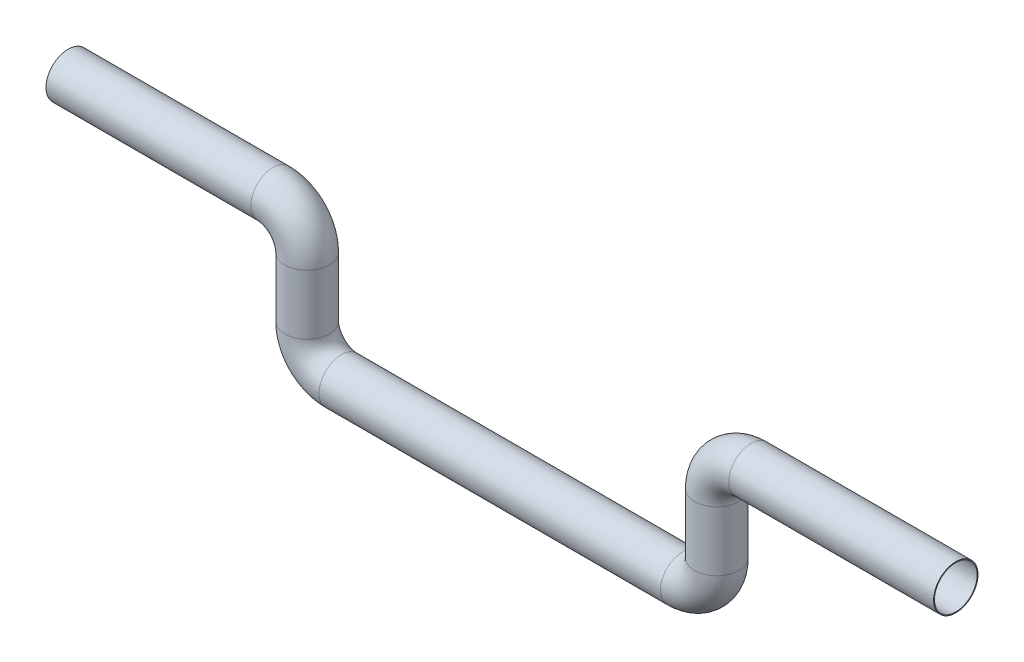
ISO-10303-21;
HEADER;
FILE_DESCRIPTION(('STEP AP214'),'2;1');
FILE_NAME('part.step','',(''),(''),'','','');
FILE_SCHEMA(('AUTOMOTIVE_DESIGN { 1 0 10303 214 1 1 1 1 }'));
ENDSEC;
DATA;
#1=APPLICATION_CONTEXT('core data for automotive mechanical design processes');
#2=APPLICATION_PROTOCOL_DEFINITION('international standard','automotive_design',2000,#1);
#3=PRODUCT_CONTEXT('',#1,'mechanical');
#4=PRODUCT('Part','Part','',(#3));
#5=PRODUCT_RELATED_PRODUCT_CATEGORY('part','',(#4));
#6=PRODUCT_DEFINITION_FORMATION('','',#4);
#7=PRODUCT_DEFINITION_CONTEXT('part definition',#1,'design');
#8=PRODUCT_DEFINITION('design','',#6,#7);
#9=PRODUCT_DEFINITION_SHAPE('','',#8);
#10=(LENGTH_UNIT() NAMED_UNIT(*) SI_UNIT(.MILLI.,.METRE.));
#11=(NAMED_UNIT(*) PLANE_ANGLE_UNIT() SI_UNIT($,.RADIAN.));
#12=(NAMED_UNIT(*) SI_UNIT($,.STERADIAN.) SOLID_ANGLE_UNIT());
#13=UNCERTAINTY_MEASURE_WITH_UNIT(LENGTH_MEASURE(1.E-05),#10,'distance_accuracy_value','');
#14=(GEOMETRIC_REPRESENTATION_CONTEXT(3) GLOBAL_UNCERTAINTY_ASSIGNED_CONTEXT((#13)) GLOBAL_UNIT_ASSIGNED_CONTEXT((#10,
#11,#12)) REPRESENTATION_CONTEXT('',''));
#15=CARTESIAN_POINT('',(0.,0.,0.));
#16=DIRECTION('',(0.,0.,1.));
#17=DIRECTION('',(1.,0.,0.));
#18=AXIS2_PLACEMENT_3D('',#15,#16,#17);
#19=CARTESIAN_POINT('',(0.,0.,0.));
#20=DIRECTION('',(1.,0.,0.));
#21=DIRECTION('',(0.,0.,-1.));
#22=AXIS2_PLACEMENT_3D('',#19,#20,#21);
#23=CYLINDRICAL_SURFACE('',#22,13.);
#24=CARTESIAN_POINT('',(100.,0.,0.));
#25=DIRECTION('',(1.,0.,0.));
#26=DIRECTION('',(0.,0.,-1.));
#27=AXIS2_PLACEMENT_3D('',#24,#25,#26);
#28=CIRCLE('',#27,13.);
#29=CARTESIAN_POINT('',(99.9999999999999,-13.,0.));
#30=VERTEX_POINT('',#29);
#31=EDGE_CURVE('E67',#30,#30,#28,.T.);
#32=ORIENTED_EDGE('',*,*,#31,.F.);
#33=EDGE_LOOP('',(#32));
#34=FACE_BOUND('',#33,.T.);
#35=CARTESIAN_POINT('',(-100.,0.,0.));
#36=DIRECTION('',(1.,0.,0.));
#37=DIRECTION('',(0.,0.,-1.));
#38=AXIS2_PLACEMENT_3D('',#35,#36,#37);
#39=CIRCLE('',#38,13.);
#40=CARTESIAN_POINT('',(-99.9999999999999,-13.,0.));
#41=VERTEX_POINT('',#40);
#42=EDGE_CURVE('E134',#41,#41,#39,.T.);
#43=ORIENTED_EDGE('',*,*,#42,.T.);
#44=EDGE_LOOP('',(#43));
#45=FACE_BOUND('',#44,.T.);
#46=ADVANCED_FACE('F43',(#34,#45),#23,.T.);
#47=CARTESIAN_POINT('',(100.,20.,0.));
#48=DIRECTION('',(0.,0.,1.));
#49=DIRECTION('',(1.,0.,0.));
#50=AXIS2_PLACEMENT_3D('',#47,#48,#49);
#51=TOROIDAL_SURFACE('',#50,20.,13.);
#52=CARTESIAN_POINT('',(120.,20.,0.));
#53=DIRECTION('',(0.,1.,0.));
#54=DIRECTION('',(0.,0.,-1.));
#55=AXIS2_PLACEMENT_3D('',#52,#53,#54);
#56=CIRCLE('',#55,13.);
#57=CARTESIAN_POINT('',(133.,20.,0.));
#58=VERTEX_POINT('',#57);
#59=EDGE_CURVE('E71',#58,#58,#56,.T.);
#60=CARTESIAN_POINT('',(100.,20.,0.));
#61=DIRECTION('',(0.,0.,1.));
#62=DIRECTION('',(1.,0.,0.));
#63=AXIS2_PLACEMENT_3D('',#60,#61,#62);
#64=CIRCLE('',#63,33.);
#65=EDGE_CURVE('',#30,#58,#64,.T.);
#66=ORIENTED_EDGE('',*,*,#31,.T.);
#67=ORIENTED_EDGE('',*,*,#59,.F.);
#68=ORIENTED_EDGE('',*,*,#65,.T.);
#69=ORIENTED_EDGE('',*,*,#65,.F.);
#70=EDGE_LOOP('',(#66,#68,#67,#69));
#71=FACE_BOUND('',#70,.T.);
#72=ADVANCED_FACE('F94',(#71),#51,.T.);
#73=CARTESIAN_POINT('',(120.,20.,0.));
#74=DIRECTION('',(0.,1.,0.));
#75=DIRECTION('',(0.,0.,1.));
#76=AXIS2_PLACEMENT_3D('',#73,#74,#75);
#77=CYLINDRICAL_SURFACE('',#76,13.);
#78=CARTESIAN_POINT('',(120.,55.,0.));
#79=DIRECTION('',(0.,1.,0.));
#80=DIRECTION('',(0.,0.,-1.));
#81=AXIS2_PLACEMENT_3D('',#78,#79,#80);
#82=CIRCLE('',#81,13.);
#83=CARTESIAN_POINT('',(107.,55.,0.));
#84=VERTEX_POINT('',#83);
#85=EDGE_CURVE('E75',#84,#84,#82,.T.);
#86=ORIENTED_EDGE('',*,*,#85,.F.);
#87=EDGE_LOOP('',(#86));
#88=FACE_BOUND('',#87,.T.);
#89=ORIENTED_EDGE('',*,*,#59,.T.);
#90=EDGE_LOOP('',(#89));
#91=FACE_BOUND('',#90,.T.);
#92=ADVANCED_FACE('F87',(#88,#91),#77,.T.);
#93=CARTESIAN_POINT('',(140.,55.,0.));
#94=DIRECTION('',(0.,0.,-1.));
#95=DIRECTION('',(-1.,0.,0.));
#96=AXIS2_PLACEMENT_3D('',#93,#94,#95);
#97=TOROIDAL_SURFACE('',#96,20.,13.);
#98=CARTESIAN_POINT('',(140.,75.,0.));
#99=DIRECTION('',(1.,0.,0.));
#100=DIRECTION('',(0.,0.,-1.));
#101=AXIS2_PLACEMENT_3D('',#98,#99,#100);
#102=CIRCLE('',#101,13.);
#103=CARTESIAN_POINT('',(140.,88.,0.));
#104=VERTEX_POINT('',#103);
#105=EDGE_CURVE('E47',#104,#104,#102,.T.);
#106=CARTESIAN_POINT('',(140.,55.,0.));
#107=DIRECTION('',(0.,0.,-1.));
#108=DIRECTION('',(-1.,0.,0.));
#109=AXIS2_PLACEMENT_3D('',#106,#107,#108);
#110=CIRCLE('',#109,33.);
#111=EDGE_CURVE('',#84,#104,#110,.T.);
#112=ORIENTED_EDGE('',*,*,#85,.T.);
#113=ORIENTED_EDGE('',*,*,#105,.F.);
#114=ORIENTED_EDGE('',*,*,#111,.T.);
#115=ORIENTED_EDGE('',*,*,#111,.F.);
#116=EDGE_LOOP('',(#112,#114,#113,#115));
#117=FACE_BOUND('',#116,.T.);
#118=ADVANCED_FACE('F85',(#117),#97,.T.);
#119=CARTESIAN_POINT('',(140.,75.,0.));
#120=DIRECTION('',(1.,0.,0.));
#121=DIRECTION('',(0.,0.,-1.));
#122=AXIS2_PLACEMENT_3D('',#119,#120,#121);
#123=CYLINDRICAL_SURFACE('',#122,13.);
#124=CARTESIAN_POINT('',(260.,75.,0.));
#125=DIRECTION('',(1.,0.,0.));
#126=DIRECTION('',(0.,0.,-1.));
#127=AXIS2_PLACEMENT_3D('',#124,#125,#126);
#128=CIRCLE('',#127,13.);
#129=CARTESIAN_POINT('',(260.,75.,-13.));
#130=VERTEX_POINT('',#129);
#131=EDGE_CURVE('E62',#130,#130,#128,.T.);
#132=ORIENTED_EDGE('',*,*,#131,.F.);
#133=EDGE_LOOP('',(#132));
#134=FACE_BOUND('',#133,.T.);
#135=ORIENTED_EDGE('',*,*,#105,.T.);
#136=EDGE_LOOP('',(#135));
#137=FACE_BOUND('',#136,.T.);
#138=ADVANCED_FACE('F45',(#134,#137),#123,.T.);
#139=CARTESIAN_POINT('',(260.,75.,0.));
#140=DIRECTION('',(1.,0.,0.));
#141=DIRECTION('',(0.,0.,-1.));
#142=AXIS2_PLACEMENT_3D('',#139,#140,#141);
#143=PLANE('',#142);
#144=CARTESIAN_POINT('',(260.,75.,0.));
#145=DIRECTION('',(1.,0.,0.));
#146=DIRECTION('',(0.,0.,-1.));
#147=AXIS2_PLACEMENT_3D('',#144,#145,#146);
#148=CIRCLE('',#147,12.5);
#149=CARTESIAN_POINT('',(260.,75.,-12.5));
#150=VERTEX_POINT('',#149);
#151=EDGE_CURVE('E10',#150,#150,#148,.F.);
#152=ORIENTED_EDGE('',*,*,#151,.T.);
#153=EDGE_LOOP('',(#152));
#154=FACE_BOUND('',#153,.T.);
#155=ORIENTED_EDGE('',*,*,#131,.T.);
#156=EDGE_LOOP('',(#155));
#157=FACE_BOUND('',#156,.T.);
#158=ADVANCED_FACE('F91',(#154,#157),#143,.T.);
#159=CARTESIAN_POINT('',(0.,0.,0.));
#160=DIRECTION('',(1.,0.,0.));
#161=DIRECTION('',(0.,0.,-1.));
#162=AXIS2_PLACEMENT_3D('',#159,#160,#161);
#163=CYLINDRICAL_SURFACE('',#162,12.5);
#164=CARTESIAN_POINT('',(100.,0.,0.));
#165=DIRECTION('',(1.,0.,0.));
#166=DIRECTION('',(0.,0.,-1.));
#167=AXIS2_PLACEMENT_3D('',#164,#165,#166);
#168=CIRCLE('',#167,12.5);
#169=CARTESIAN_POINT('',(99.9999999999999,-12.5,0.));
#170=VERTEX_POINT('',#169);
#171=EDGE_CURVE('E66',#170,#170,#168,.F.);
#172=ORIENTED_EDGE('',*,*,#171,.F.);
#173=EDGE_LOOP('',(#172));
#174=FACE_BOUND('',#173,.T.);
#175=CARTESIAN_POINT('',(-100.,0.,0.));
#176=DIRECTION('',(1.,0.,0.));
#177=DIRECTION('',(0.,0.,-1.));
#178=AXIS2_PLACEMENT_3D('',#175,#176,#177);
#179=CIRCLE('',#178,12.5);
#180=CARTESIAN_POINT('',(-99.9999999999999,-12.5,0.));
#181=VERTEX_POINT('',#180);
#182=EDGE_CURVE('E180',#181,#181,#179,.F.);
#183=ORIENTED_EDGE('',*,*,#182,.T.);
#184=EDGE_LOOP('',(#183));
#185=FACE_BOUND('',#184,.T.);
#186=ADVANCED_FACE('F118',(#174,#185),#163,.F.);
#187=CARTESIAN_POINT('',(100.,20.,0.));
#188=DIRECTION('',(0.,0.,1.));
#189=DIRECTION('',(1.,0.,0.));
#190=AXIS2_PLACEMENT_3D('',#187,#188,#189);
#191=TOROIDAL_SURFACE('',#190,20.,12.5);
#192=CARTESIAN_POINT('',(120.,20.,0.));
#193=DIRECTION('',(0.,1.,0.));
#194=DIRECTION('',(0.,0.,-1.));
#195=AXIS2_PLACEMENT_3D('',#192,#193,#194);
#196=CIRCLE('',#195,12.5);
#197=CARTESIAN_POINT('',(132.5,20.,0.));
#198=VERTEX_POINT('',#197);
#199=EDGE_CURVE('E157',#198,#198,#196,.F.);
#200=CARTESIAN_POINT('',(100.,20.,0.));
#201=DIRECTION('',(0.,0.,1.));
#202=DIRECTION('',(1.,0.,0.));
#203=AXIS2_PLACEMENT_3D('',#200,#201,#202);
#204=CIRCLE('',#203,32.5);
#205=EDGE_CURVE('',#170,#198,#204,.T.);
#206=ORIENTED_EDGE('',*,*,#171,.T.);
#207=ORIENTED_EDGE('',*,*,#199,.F.);
#208=ORIENTED_EDGE('',*,*,#205,.T.);
#209=ORIENTED_EDGE('',*,*,#205,.F.);
#210=EDGE_LOOP('',(#206,#208,#207,#209));
#211=FACE_BOUND('',#210,.T.);
#212=ADVANCED_FACE('F167',(#211),#191,.F.);
#213=CARTESIAN_POINT('',(120.,20.,0.));
#214=DIRECTION('',(0.,1.,0.));
#215=DIRECTION('',(0.,0.,1.));
#216=AXIS2_PLACEMENT_3D('',#213,#214,#215);
#217=CYLINDRICAL_SURFACE('',#216,12.5);
#218=CARTESIAN_POINT('',(120.,55.,0.));
#219=DIRECTION('',(0.,1.,0.));
#220=DIRECTION('',(0.,0.,-1.));
#221=AXIS2_PLACEMENT_3D('',#218,#219,#220);
#222=CIRCLE('',#221,12.5);
#223=CARTESIAN_POINT('',(107.5,55.,0.));
#224=VERTEX_POINT('',#223);
#225=EDGE_CURVE('E58',#224,#224,#222,.F.);
#226=ORIENTED_EDGE('',*,*,#225,.F.);
#227=EDGE_LOOP('',(#226));
#228=FACE_BOUND('',#227,.T.);
#229=ORIENTED_EDGE('',*,*,#199,.T.);
#230=EDGE_LOOP('',(#229));
#231=FACE_BOUND('',#230,.T.);
#232=ADVANCED_FACE('F110',(#228,#231),#217,.F.);
#233=CARTESIAN_POINT('',(140.,55.,0.));
#234=DIRECTION('',(0.,0.,-1.));
#235=DIRECTION('',(-1.,0.,0.));
#236=AXIS2_PLACEMENT_3D('',#233,#234,#235);
#237=TOROIDAL_SURFACE('',#236,20.,12.5);
#238=CARTESIAN_POINT('',(140.,75.,0.));
#239=DIRECTION('',(1.,0.,0.));
#240=DIRECTION('',(0.,0.,-1.));
#241=AXIS2_PLACEMENT_3D('',#238,#239,#240);
#242=CIRCLE('',#241,12.5);
#243=CARTESIAN_POINT('',(140.,87.5,0.));
#244=VERTEX_POINT('',#243);
#245=EDGE_CURVE('E52',#244,#244,#242,.F.);
#246=CARTESIAN_POINT('',(140.,55.,0.));
#247=DIRECTION('',(0.,0.,-1.));
#248=DIRECTION('',(-1.,0.,0.));
#249=AXIS2_PLACEMENT_3D('',#246,#247,#248);
#250=CIRCLE('',#249,32.5);
#251=EDGE_CURVE('',#224,#244,#250,.T.);
#252=ORIENTED_EDGE('',*,*,#225,.T.);
#253=ORIENTED_EDGE('',*,*,#245,.F.);
#254=ORIENTED_EDGE('',*,*,#251,.T.);
#255=ORIENTED_EDGE('',*,*,#251,.F.);
#256=EDGE_LOOP('',(#252,#254,#253,#255));
#257=FACE_BOUND('',#256,.T.);
#258=ADVANCED_FACE('F100',(#257),#237,.F.);
#259=CARTESIAN_POINT('',(140.,75.,0.));
#260=DIRECTION('',(1.,0.,0.));
#261=DIRECTION('',(0.,0.,-1.));
#262=AXIS2_PLACEMENT_3D('',#259,#260,#261);
#263=CYLINDRICAL_SURFACE('',#262,12.5);
#264=ORIENTED_EDGE('',*,*,#151,.F.);
#265=EDGE_LOOP('',(#264));
#266=FACE_BOUND('',#265,.T.);
#267=ORIENTED_EDGE('',*,*,#245,.T.);
#268=EDGE_LOOP('',(#267));
#269=FACE_BOUND('',#268,.T.);
#270=ADVANCED_FACE('F97',(#266,#269),#263,.F.);
#271=CARTESIAN_POINT('',(-100.,20.,0.));
#272=DIRECTION('',(0.,0.,1.));
#273=DIRECTION('',(-1.,0.,0.));
#274=AXIS2_PLACEMENT_3D('',#271,#272,#273);
#275=TOROIDAL_SURFACE('',#274,20.,13.);
#276=CARTESIAN_POINT('',(-120.,20.,0.));
#277=DIRECTION('',(0.,-1.,0.));
#278=DIRECTION('',(0.,0.,-1.));
#279=AXIS2_PLACEMENT_3D('',#276,#277,#278);
#280=CIRCLE('',#279,13.);
#281=CARTESIAN_POINT('',(-133.,20.,0.));
#282=VERTEX_POINT('',#281);
#283=EDGE_CURVE('E137',#282,#282,#280,.T.);
#284=CARTESIAN_POINT('',(-100.,20.,0.));
#285=DIRECTION('',(0.,0.,1.));
#286=DIRECTION('',(-1.,0.,0.));
#287=AXIS2_PLACEMENT_3D('',#284,#285,#286);
#288=CIRCLE('',#287,33.);
#289=EDGE_CURVE('',#282,#41,#288,.T.);
#290=ORIENTED_EDGE('',*,*,#283,.T.);
#291=ORIENTED_EDGE('',*,*,#42,.F.);
#292=ORIENTED_EDGE('',*,*,#289,.T.);
#293=ORIENTED_EDGE('',*,*,#289,.F.);
#294=EDGE_LOOP('',(#290,#292,#291,#293));
#295=FACE_BOUND('',#294,.T.);
#296=ADVANCED_FACE('F99',(#295),#275,.T.);
#297=CARTESIAN_POINT('',(-120.,20.,0.));
#298=DIRECTION('',(0.,1.,0.));
#299=DIRECTION('',(0.,0.,1.));
#300=AXIS2_PLACEMENT_3D('',#297,#298,#299);
#301=CYLINDRICAL_SURFACE('',#300,13.);
#302=CARTESIAN_POINT('',(-120.,55.,0.));
#303=DIRECTION('',(0.,-1.,0.));
#304=DIRECTION('',(0.,0.,-1.));
#305=AXIS2_PLACEMENT_3D('',#302,#303,#304);
#306=CIRCLE('',#305,13.);
#307=CARTESIAN_POINT('',(-107.,55.,0.));
#308=VERTEX_POINT('',#307);
#309=EDGE_CURVE('E141',#308,#308,#306,.T.);
#310=ORIENTED_EDGE('',*,*,#309,.T.);
#311=EDGE_LOOP('',(#310));
#312=FACE_BOUND('',#311,.T.);
#313=ORIENTED_EDGE('',*,*,#283,.F.);
#314=EDGE_LOOP('',(#313));
#315=FACE_BOUND('',#314,.T.);
#316=ADVANCED_FACE('F107',(#312,#315),#301,.T.);
#317=CARTESIAN_POINT('',(-140.,55.,0.));
#318=DIRECTION('',(0.,0.,-1.));
#319=DIRECTION('',(1.,0.,0.));
#320=AXIS2_PLACEMENT_3D('',#317,#318,#319);
#321=TOROIDAL_SURFACE('',#320,20.,13.);
#322=CARTESIAN_POINT('',(-140.,75.,0.));
#323=DIRECTION('',(1.,0.,0.));
#324=DIRECTION('',(0.,0.,-1.));
#325=AXIS2_PLACEMENT_3D('',#322,#323,#324);
#326=CIRCLE('',#325,13.);
#327=CARTESIAN_POINT('',(-140.,88.,0.));
#328=VERTEX_POINT('',#327);
#329=EDGE_CURVE('E150',#328,#328,#326,.T.);
#330=CARTESIAN_POINT('',(-140.,55.,0.));
#331=DIRECTION('',(0.,0.,-1.));
#332=DIRECTION('',(1.,0.,0.));
#333=AXIS2_PLACEMENT_3D('',#330,#331,#332);
#334=CIRCLE('',#333,33.);
#335=EDGE_CURVE('',#328,#308,#334,.T.);
#336=ORIENTED_EDGE('',*,*,#329,.T.);
#337=ORIENTED_EDGE('',*,*,#309,.F.);
#338=ORIENTED_EDGE('',*,*,#335,.T.);
#339=ORIENTED_EDGE('',*,*,#335,.F.);
#340=EDGE_LOOP('',(#336,#338,#337,#339));
#341=FACE_BOUND('',#340,.T.);
#342=ADVANCED_FACE('F215',(#341),#321,.T.);
#343=CARTESIAN_POINT('',(-140.,75.,0.));
#344=DIRECTION('',(-1.,0.,0.));
#345=DIRECTION('',(0.,0.,-1.));
#346=AXIS2_PLACEMENT_3D('',#343,#344,#345);
#347=CYLINDRICAL_SURFACE('',#346,13.);
#348=CARTESIAN_POINT('',(-260.,75.,0.));
#349=DIRECTION('',(1.,0.,0.));
#350=DIRECTION('',(0.,0.,-1.));
#351=AXIS2_PLACEMENT_3D('',#348,#349,#350);
#352=CIRCLE('',#351,13.);
#353=CARTESIAN_POINT('',(-260.,75.,-13.));
#354=VERTEX_POINT('',#353);
#355=EDGE_CURVE('E144',#354,#354,#352,.T.);
#356=ORIENTED_EDGE('',*,*,#355,.T.);
#357=EDGE_LOOP('',(#356));
#358=FACE_BOUND('',#357,.T.);
#359=ORIENTED_EDGE('',*,*,#329,.F.);
#360=EDGE_LOOP('',(#359));
#361=FACE_BOUND('',#360,.T.);
#362=ADVANCED_FACE('F209',(#358,#361),#347,.T.);
#363=CARTESIAN_POINT('',(-260.,75.,0.));
#364=DIRECTION('',(-1.,0.,0.));
#365=DIRECTION('',(0.,0.,-1.));
#366=AXIS2_PLACEMENT_3D('',#363,#364,#365);
#367=PLANE('',#366);
#368=CARTESIAN_POINT('',(-260.,75.,0.));
#369=DIRECTION('',(1.,0.,0.));
#370=DIRECTION('',(0.,0.,-1.));
#371=AXIS2_PLACEMENT_3D('',#368,#369,#370);
#372=CIRCLE('',#371,12.5);
#373=CARTESIAN_POINT('',(-260.,75.,-12.5));
#374=VERTEX_POINT('',#373);
#375=EDGE_CURVE('E72',#374,#374,#372,.F.);
#376=ORIENTED_EDGE('',*,*,#375,.F.);
#377=EDGE_LOOP('',(#376));
#378=FACE_BOUND('',#377,.T.);
#379=ORIENTED_EDGE('',*,*,#355,.F.);
#380=EDGE_LOOP('',(#379));
#381=FACE_BOUND('',#380,.T.);
#382=ADVANCED_FACE('F205',(#378,#381),#367,.T.);
#383=CARTESIAN_POINT('',(-100.,20.,0.));
#384=DIRECTION('',(0.,0.,1.));
#385=DIRECTION('',(-1.,0.,0.));
#386=AXIS2_PLACEMENT_3D('',#383,#384,#385);
#387=TOROIDAL_SURFACE('',#386,20.,12.5);
#388=CARTESIAN_POINT('',(-120.,20.,0.));
#389=DIRECTION('',(0.,-1.,0.));
#390=DIRECTION('',(0.,0.,-1.));
#391=AXIS2_PLACEMENT_3D('',#388,#389,#390);
#392=CIRCLE('',#391,12.5);
#393=CARTESIAN_POINT('',(-132.5,20.,0.));
#394=VERTEX_POINT('',#393);
#395=EDGE_CURVE('E183',#394,#394,#392,.F.);
#396=CARTESIAN_POINT('',(-100.,20.,0.));
#397=DIRECTION('',(0.,0.,1.));
#398=DIRECTION('',(-1.,0.,0.));
#399=AXIS2_PLACEMENT_3D('',#396,#397,#398);
#400=CIRCLE('',#399,32.5);
#401=EDGE_CURVE('',#394,#181,#400,.T.);
#402=ORIENTED_EDGE('',*,*,#395,.T.);
#403=ORIENTED_EDGE('',*,*,#182,.F.);
#404=ORIENTED_EDGE('',*,*,#401,.T.);
#405=ORIENTED_EDGE('',*,*,#401,.F.);
#406=EDGE_LOOP('',(#402,#404,#403,#405));
#407=FACE_BOUND('',#406,.T.);
#408=ADVANCED_FACE('F208',(#407),#387,.F.);
#409=CARTESIAN_POINT('',(-120.,20.,0.));
#410=DIRECTION('',(0.,1.,0.));
#411=DIRECTION('',(0.,0.,1.));
#412=AXIS2_PLACEMENT_3D('',#409,#410,#411);
#413=CYLINDRICAL_SURFACE('',#412,12.5);
#414=CARTESIAN_POINT('',(-120.,55.,0.));
#415=DIRECTION('',(0.,-1.,0.));
#416=DIRECTION('',(0.,0.,-1.));
#417=AXIS2_PLACEMENT_3D('',#414,#415,#416);
#418=CIRCLE('',#417,12.5);
#419=CARTESIAN_POINT('',(-107.5,55.,0.));
#420=VERTEX_POINT('',#419);
#421=EDGE_CURVE('E188',#420,#420,#418,.F.);
#422=ORIENTED_EDGE('',*,*,#421,.T.);
#423=EDGE_LOOP('',(#422));
#424=FACE_BOUND('',#423,.T.);
#425=ORIENTED_EDGE('',*,*,#395,.F.);
#426=EDGE_LOOP('',(#425));
#427=FACE_BOUND('',#426,.T.);
#428=ADVANCED_FACE('F236',(#424,#427),#413,.F.);
#429=CARTESIAN_POINT('',(-140.,55.,0.));
#430=DIRECTION('',(0.,0.,-1.));
#431=DIRECTION('',(1.,0.,0.));
#432=AXIS2_PLACEMENT_3D('',#429,#430,#431);
#433=TOROIDAL_SURFACE('',#432,20.,12.5);
#434=CARTESIAN_POINT('',(-140.,75.,0.));
#435=DIRECTION('',(1.,0.,0.));
#436=DIRECTION('',(0.,0.,-1.));
#437=AXIS2_PLACEMENT_3D('',#434,#435,#436);
#438=CIRCLE('',#437,12.5);
#439=CARTESIAN_POINT('',(-140.,87.5,0.));
#440=VERTEX_POINT('',#439);
#441=EDGE_CURVE('E195',#440,#440,#438,.F.);
#442=CARTESIAN_POINT('',(-140.,55.,0.));
#443=DIRECTION('',(0.,0.,-1.));
#444=DIRECTION('',(1.,0.,0.));
#445=AXIS2_PLACEMENT_3D('',#442,#443,#444);
#446=CIRCLE('',#445,32.5);
#447=EDGE_CURVE('',#440,#420,#446,.T.);
#448=ORIENTED_EDGE('',*,*,#441,.T.);
#449=ORIENTED_EDGE('',*,*,#421,.F.);
#450=ORIENTED_EDGE('',*,*,#447,.T.);
#451=ORIENTED_EDGE('',*,*,#447,.F.);
#452=EDGE_LOOP('',(#448,#450,#449,#451));
#453=FACE_BOUND('',#452,.T.);
#454=ADVANCED_FACE('F233',(#453),#433,.F.);
#455=CARTESIAN_POINT('',(-140.,75.,0.));
#456=DIRECTION('',(-1.,0.,0.));
#457=DIRECTION('',(0.,0.,-1.));
#458=AXIS2_PLACEMENT_3D('',#455,#456,#457);
#459=CYLINDRICAL_SURFACE('',#458,12.5);
#460=ORIENTED_EDGE('',*,*,#375,.T.);
#461=EDGE_LOOP('',(#460));
#462=FACE_BOUND('',#461,.T.);
#463=ORIENTED_EDGE('',*,*,#441,.F.);
#464=EDGE_LOOP('',(#463));
#465=FACE_BOUND('',#464,.T.);
#466=ADVANCED_FACE('F202',(#462,#465),#459,.F.);
#467=CLOSED_SHELL('',(#46,#72,#92,#118,#138,#158,#186,#212,#232,#258,#270,#296,#316,#342,#362,
#382,#408,#428,#454,#466));
#468=MANIFOLD_SOLID_BREP('B2',#467);
#469=ADVANCED_BREP_SHAPE_REPRESENTATION('',(#18,#468),#14);
#470=SHAPE_DEFINITION_REPRESENTATION(#9,#469);
ENDSEC;
END-ISO-10303-21;
